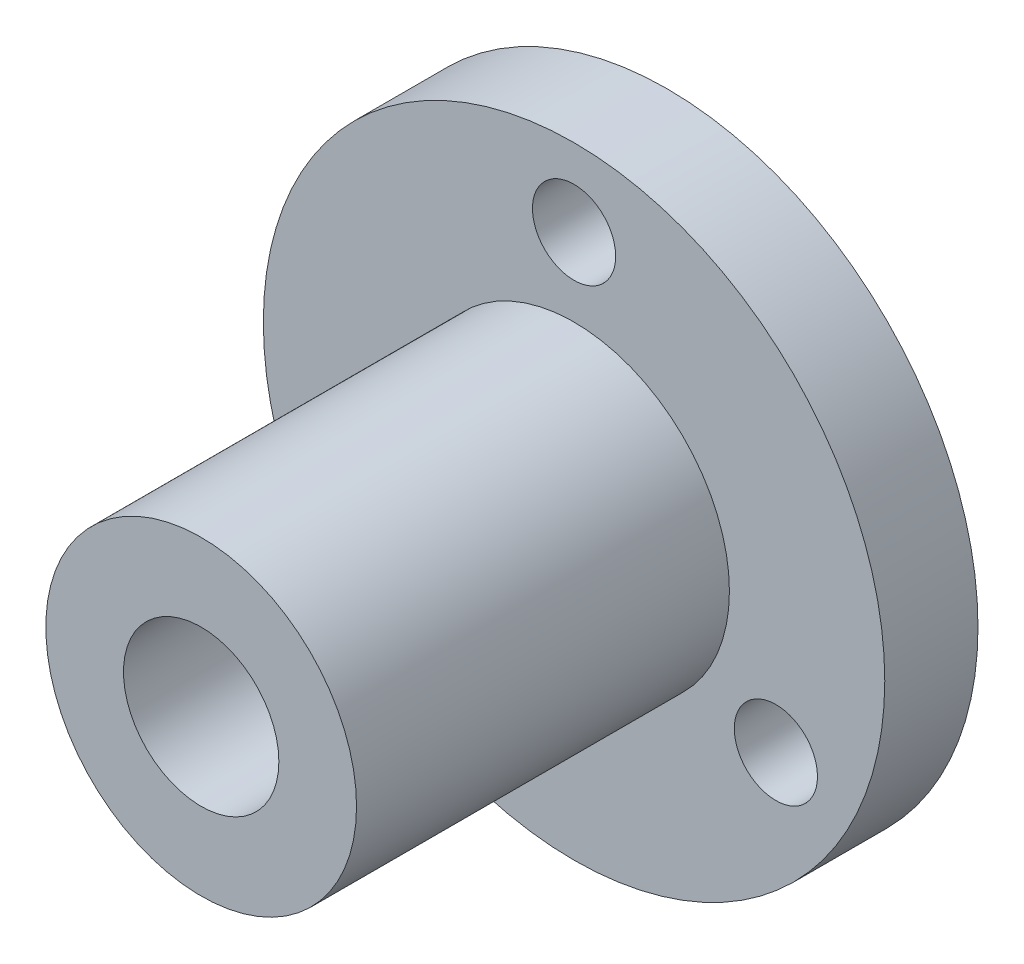
ISO-10303-21;
HEADER;
FILE_DESCRIPTION(('STEP AP214'),'2;1');
FILE_NAME('part.step','',(''),(''),'','','');
FILE_SCHEMA(('AUTOMOTIVE_DESIGN { 1 0 10303 214 1 1 1 1 }'));
ENDSEC;
DATA;
#1=APPLICATION_CONTEXT('core data for automotive mechanical design processes');
#2=APPLICATION_PROTOCOL_DEFINITION('international standard','automotive_design',2000,#1);
#3=PRODUCT_CONTEXT('',#1,'mechanical');
#4=PRODUCT('Part','Part','',(#3));
#5=PRODUCT_RELATED_PRODUCT_CATEGORY('part','',(#4));
#6=PRODUCT_DEFINITION_FORMATION('','',#4);
#7=PRODUCT_DEFINITION_CONTEXT('part definition',#1,'design');
#8=PRODUCT_DEFINITION('design','',#6,#7);
#9=PRODUCT_DEFINITION_SHAPE('','',#8);
#10=(LENGTH_UNIT() NAMED_UNIT(*) SI_UNIT(.MILLI.,.METRE.));
#11=(NAMED_UNIT(*) PLANE_ANGLE_UNIT() SI_UNIT($,.RADIAN.));
#12=(NAMED_UNIT(*) SI_UNIT($,.STERADIAN.) SOLID_ANGLE_UNIT());
#13=UNCERTAINTY_MEASURE_WITH_UNIT(LENGTH_MEASURE(1.E-05),#10,'distance_accuracy_value','');
#14=(GEOMETRIC_REPRESENTATION_CONTEXT(3) GLOBAL_UNCERTAINTY_ASSIGNED_CONTEXT((#13)) GLOBAL_UNIT_ASSIGNED_CONTEXT((#10,
#11,#12)) REPRESENTATION_CONTEXT('',''));
#15=CARTESIAN_POINT('',(0.,0.,0.));
#16=DIRECTION('',(0.,0.,1.));
#17=DIRECTION('',(1.,0.,0.));
#18=AXIS2_PLACEMENT_3D('',#15,#16,#17);
#19=CARTESIAN_POINT('',(0.,0.,3.81));
#20=DIRECTION('',(0.,0.,-1.));
#21=DIRECTION('',(-1.,0.,0.));
#22=AXIS2_PLACEMENT_3D('',#19,#20,#21);
#23=CYLINDRICAL_SURFACE('',#22,12.7);
#24=CARTESIAN_POINT('',(0.,0.,3.81));
#25=DIRECTION('',(0.,0.,1.));
#26=DIRECTION('',(1.,0.,0.));
#27=AXIS2_PLACEMENT_3D('',#24,#25,#26);
#28=CIRCLE('',#27,12.7);
#29=CARTESIAN_POINT('',(12.7,0.,3.81));
#30=VERTEX_POINT('',#29);
#31=EDGE_CURVE('E44',#30,#30,#28,.T.);
#32=ORIENTED_EDGE('',*,*,#31,.F.);
#33=EDGE_LOOP('',(#32));
#34=FACE_BOUND('',#33,.T.);
#35=CARTESIAN_POINT('',(0.,0.,0.));
#36=DIRECTION('',(0.,0.,1.));
#37=DIRECTION('',(1.,0.,0.));
#38=AXIS2_PLACEMENT_3D('',#35,#36,#37);
#39=CIRCLE('',#38,12.7);
#40=CARTESIAN_POINT('',(12.7,0.,0.));
#41=VERTEX_POINT('',#40);
#42=EDGE_CURVE('E40',#41,#41,#39,.T.);
#43=ORIENTED_EDGE('',*,*,#42,.T.);
#44=EDGE_LOOP('',(#43));
#45=FACE_BOUND('',#44,.T.);
#46=ADVANCED_FACE('F37',(#34,#45),#23,.T.);
#47=CARTESIAN_POINT('',(0.,0.,3.81));
#48=DIRECTION('',(0.,0.,1.));
#49=DIRECTION('',(1.,0.,0.));
#50=AXIS2_PLACEMENT_3D('',#47,#48,#49);
#51=PLANE('',#50);
#52=CARTESIAN_POINT('',(-8.24889197104682,-4.76249999999992,3.81));
#53=DIRECTION('',(0.,0.,1.));
#54=DIRECTION('',(1.,0.,0.));
#55=AXIS2_PLACEMENT_3D('',#52,#53,#54);
#56=CIRCLE('',#55,1.7);
#57=CARTESIAN_POINT('',(-6.54889197104682,-4.76249999999992,3.81));
#58=VERTEX_POINT('',#57);
#59=EDGE_CURVE('E74',#58,#58,#56,.T.);
#60=ORIENTED_EDGE('',*,*,#59,.F.);
#61=EDGE_LOOP('',(#60));
#62=FACE_BOUND('',#61,.T.);
#63=CARTESIAN_POINT('',(8.24889197104676,-4.76250000000004,3.81));
#64=DIRECTION('',(0.,0.,1.));
#65=DIRECTION('',(1.,0.,0.));
#66=AXIS2_PLACEMENT_3D('',#63,#64,#65);
#67=CIRCLE('',#66,1.7);
#68=CARTESIAN_POINT('',(9.94889197104676,-4.76250000000004,3.81));
#69=VERTEX_POINT('',#68);
#70=EDGE_CURVE('E68',#69,#69,#67,.T.);
#71=ORIENTED_EDGE('',*,*,#70,.F.);
#72=EDGE_LOOP('',(#71));
#73=FACE_BOUND('',#72,.T.);
#74=CARTESIAN_POINT('',(0.,9.525,3.81));
#75=DIRECTION('',(0.,0.,1.));
#76=DIRECTION('',(1.,0.,0.));
#77=AXIS2_PLACEMENT_3D('',#74,#75,#76);
#78=CIRCLE('',#77,1.7);
#79=CARTESIAN_POINT('',(1.7,9.525,3.81));
#80=VERTEX_POINT('',#79);
#81=EDGE_CURVE('E62',#80,#80,#78,.T.);
#82=ORIENTED_EDGE('',*,*,#81,.F.);
#83=EDGE_LOOP('',(#82));
#84=FACE_BOUND('',#83,.T.);
#85=CARTESIAN_POINT('',(0.,0.,3.81));
#86=DIRECTION('',(0.,0.,1.));
#87=DIRECTION('',(1.,0.,0.));
#88=AXIS2_PLACEMENT_3D('',#85,#86,#87);
#89=CIRCLE('',#88,6.35);
#90=CARTESIAN_POINT('',(6.35,0.,3.81));
#91=VERTEX_POINT('',#90);
#92=EDGE_CURVE('E10',#91,#91,#89,.T.);
#93=ORIENTED_EDGE('',*,*,#92,.F.);
#94=EDGE_LOOP('',(#93));
#95=FACE_BOUND('',#94,.T.);
#96=ORIENTED_EDGE('',*,*,#31,.T.);
#97=EDGE_LOOP('',(#96));
#98=FACE_BOUND('',#97,.T.);
#99=ADVANCED_FACE('F80',(#62,#73,#84,#95,#98),#51,.T.);
#100=CARTESIAN_POINT('',(0.,0.,0.));
#101=DIRECTION('',(0.,0.,1.));
#102=DIRECTION('',(1.,0.,0.));
#103=AXIS2_PLACEMENT_3D('',#100,#101,#102);
#104=PLANE('',#103);
#105=CARTESIAN_POINT('',(-8.24889197104682,-4.76249999999992,0.));
#106=DIRECTION('',(0.,0.,1.));
#107=DIRECTION('',(1.,0.,0.));
#108=AXIS2_PLACEMENT_3D('',#105,#106,#107);
#109=CIRCLE('',#108,1.69999999999999);
#110=CARTESIAN_POINT('',(-6.54889197104683,-4.76249999999992,0.));
#111=VERTEX_POINT('',#110);
#112=EDGE_CURVE('E71',#111,#111,#109,.T.);
#113=ORIENTED_EDGE('',*,*,#112,.T.);
#114=EDGE_LOOP('',(#113));
#115=FACE_BOUND('',#114,.T.);
#116=CARTESIAN_POINT('',(8.24889197104676,-4.76250000000004,0.));
#117=DIRECTION('',(0.,0.,1.));
#118=DIRECTION('',(1.,0.,0.));
#119=AXIS2_PLACEMENT_3D('',#116,#117,#118);
#120=CIRCLE('',#119,1.69999999999999);
#121=CARTESIAN_POINT('',(9.94889197104675,-4.76250000000004,0.));
#122=VERTEX_POINT('',#121);
#123=EDGE_CURVE('E65',#122,#122,#120,.T.);
#124=ORIENTED_EDGE('',*,*,#123,.T.);
#125=EDGE_LOOP('',(#124));
#126=FACE_BOUND('',#125,.T.);
#127=CARTESIAN_POINT('',(0.,9.525,0.));
#128=DIRECTION('',(0.,0.,1.));
#129=DIRECTION('',(1.,0.,0.));
#130=AXIS2_PLACEMENT_3D('',#127,#128,#129);
#131=CIRCLE('',#130,1.69999999999999);
#132=CARTESIAN_POINT('',(1.69999999999999,9.525,0.));
#133=VERTEX_POINT('',#132);
#134=EDGE_CURVE('E59',#133,#133,#131,.T.);
#135=ORIENTED_EDGE('',*,*,#134,.T.);
#136=EDGE_LOOP('',(#135));
#137=FACE_BOUND('',#136,.T.);
#138=CARTESIAN_POINT('',(0.,0.,0.));
#139=DIRECTION('',(0.,0.,1.));
#140=DIRECTION('',(1.,0.,0.));
#141=AXIS2_PLACEMENT_3D('',#138,#139,#140);
#142=CIRCLE('',#141,3.17499999999999);
#143=CARTESIAN_POINT('',(3.17499999999999,0.,0.));
#144=VERTEX_POINT('',#143);
#145=EDGE_CURVE('E53',#144,#144,#142,.T.);
#146=ORIENTED_EDGE('',*,*,#145,.T.);
#147=EDGE_LOOP('',(#146));
#148=FACE_BOUND('',#147,.T.);
#149=ORIENTED_EDGE('',*,*,#42,.F.);
#150=EDGE_LOOP('',(#149));
#151=FACE_BOUND('',#150,.T.);
#152=ADVANCED_FACE('F83',(#115,#126,#137,#148,#151),#104,.F.);
#153=CARTESIAN_POINT('',(0.,0.,19.05));
#154=DIRECTION('',(0.,0.,-1.));
#155=DIRECTION('',(-1.,0.,0.));
#156=AXIS2_PLACEMENT_3D('',#153,#154,#155);
#157=CYLINDRICAL_SURFACE('',#156,6.35);
#158=CARTESIAN_POINT('',(0.,0.,19.05));
#159=DIRECTION('',(0.,0.,1.));
#160=DIRECTION('',(1.,0.,0.));
#161=AXIS2_PLACEMENT_3D('',#158,#159,#160);
#162=CIRCLE('',#161,6.35);
#163=CARTESIAN_POINT('',(6.35,0.,19.05));
#164=VERTEX_POINT('',#163);
#165=EDGE_CURVE('E50',#164,#164,#162,.T.);
#166=ORIENTED_EDGE('',*,*,#165,.F.);
#167=EDGE_LOOP('',(#166));
#168=FACE_BOUND('',#167,.T.);
#169=ORIENTED_EDGE('',*,*,#92,.T.);
#170=EDGE_LOOP('',(#169));
#171=FACE_BOUND('',#170,.T.);
#172=ADVANCED_FACE('F98',(#168,#171),#157,.T.);
#173=CARTESIAN_POINT('',(0.,0.,19.05));
#174=DIRECTION('',(0.,0.,1.));
#175=DIRECTION('',(1.,0.,0.));
#176=AXIS2_PLACEMENT_3D('',#173,#174,#175);
#177=PLANE('',#176);
#178=CARTESIAN_POINT('',(0.,0.,19.05));
#179=DIRECTION('',(0.,0.,1.));
#180=DIRECTION('',(1.,0.,0.));
#181=AXIS2_PLACEMENT_3D('',#178,#179,#180);
#182=CIRCLE('',#181,3.17499999999999);
#183=CARTESIAN_POINT('',(3.17499999999999,0.,19.05));
#184=VERTEX_POINT('',#183);
#185=EDGE_CURVE('E56',#184,#184,#182,.T.);
#186=ORIENTED_EDGE('',*,*,#185,.F.);
#187=EDGE_LOOP('',(#186));
#188=FACE_BOUND('',#187,.T.);
#189=ORIENTED_EDGE('',*,*,#165,.T.);
#190=EDGE_LOOP('',(#189));
#191=FACE_BOUND('',#190,.T.);
#192=ADVANCED_FACE('F104',(#188,#191),#177,.T.);
#193=CARTESIAN_POINT('',(0.,0.,19.05));
#194=DIRECTION('',(0.,0.,1.));
#195=DIRECTION('',(1.,0.,0.));
#196=AXIS2_PLACEMENT_3D('',#193,#194,#195);
#197=CYLINDRICAL_SURFACE('',#196,3.17499999999999);
#198=ORIENTED_EDGE('',*,*,#145,.F.);
#199=EDGE_LOOP('',(#198));
#200=FACE_BOUND('',#199,.T.);
#201=ORIENTED_EDGE('',*,*,#185,.T.);
#202=EDGE_LOOP('',(#201));
#203=FACE_BOUND('',#202,.T.);
#204=ADVANCED_FACE('F111',(#200,#203),#197,.F.);
#205=CARTESIAN_POINT('',(0.,9.525,3.81));
#206=DIRECTION('',(0.,0.,1.));
#207=DIRECTION('',(1.,0.,0.));
#208=AXIS2_PLACEMENT_3D('',#205,#206,#207);
#209=CYLINDRICAL_SURFACE('',#208,1.7);
#210=ORIENTED_EDGE('',*,*,#134,.F.);
#211=EDGE_LOOP('',(#210));
#212=FACE_BOUND('',#211,.T.);
#213=ORIENTED_EDGE('',*,*,#81,.T.);
#214=EDGE_LOOP('',(#213));
#215=FACE_BOUND('',#214,.T.);
#216=ADVANCED_FACE('F115',(#212,#215),#209,.F.);
#217=CARTESIAN_POINT('',(8.24889197104676,-4.76250000000004,3.81));
#218=DIRECTION('',(0.,0.,1.));
#219=DIRECTION('',(1.,0.,0.));
#220=AXIS2_PLACEMENT_3D('',#217,#218,#219);
#221=CYLINDRICAL_SURFACE('',#220,1.7);
#222=ORIENTED_EDGE('',*,*,#123,.F.);
#223=EDGE_LOOP('',(#222));
#224=FACE_BOUND('',#223,.T.);
#225=ORIENTED_EDGE('',*,*,#70,.T.);
#226=EDGE_LOOP('',(#225));
#227=FACE_BOUND('',#226,.T.);
#228=ADVANCED_FACE('F119',(#224,#227),#221,.F.);
#229=CARTESIAN_POINT('',(-8.24889197104682,-4.76249999999992,3.81));
#230=DIRECTION('',(0.,0.,1.));
#231=DIRECTION('',(1.,0.,0.));
#232=AXIS2_PLACEMENT_3D('',#229,#230,#231);
#233=CYLINDRICAL_SURFACE('',#232,1.7);
#234=ORIENTED_EDGE('',*,*,#112,.F.);
#235=EDGE_LOOP('',(#234));
#236=FACE_BOUND('',#235,.T.);
#237=ORIENTED_EDGE('',*,*,#59,.T.);
#238=EDGE_LOOP('',(#237));
#239=FACE_BOUND('',#238,.T.);
#240=ADVANCED_FACE('F78',(#236,#239),#233,.F.);
#241=CLOSED_SHELL('',(#46,#99,#152,#172,#192,#204,#216,#228,#240));
#242=MANIFOLD_SOLID_BREP('B2',#241);
#243=ADVANCED_BREP_SHAPE_REPRESENTATION('',(#18,#242),#14);
#244=SHAPE_DEFINITION_REPRESENTATION(#9,#243);
ENDSEC;
END-ISO-10303-21;
